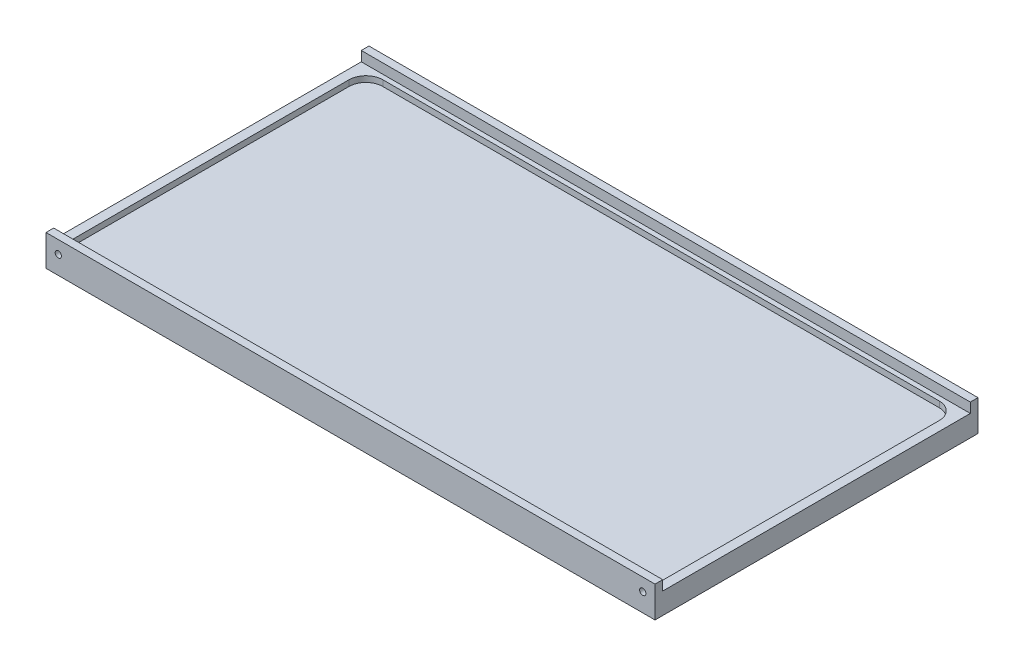
ISO-10303-21;
HEADER;
FILE_DESCRIPTION(('STEP AP214'),'2;1');
FILE_NAME('part.step','',(''),(''),'','','');
FILE_SCHEMA(('AUTOMOTIVE_DESIGN { 1 0 10303 214 1 1 1 1 }'));
ENDSEC;
DATA;
#1=APPLICATION_CONTEXT('core data for automotive mechanical design processes');
#2=APPLICATION_PROTOCOL_DEFINITION('international standard','automotive_design',2000,#1);
#3=PRODUCT_CONTEXT('',#1,'mechanical');
#4=PRODUCT('Part','Part','',(#3));
#5=PRODUCT_RELATED_PRODUCT_CATEGORY('part','',(#4));
#6=PRODUCT_DEFINITION_FORMATION('','',#4);
#7=PRODUCT_DEFINITION_CONTEXT('part definition',#1,'design');
#8=PRODUCT_DEFINITION('design','',#6,#7);
#9=PRODUCT_DEFINITION_SHAPE('','',#8);
#10=(LENGTH_UNIT() NAMED_UNIT(*) SI_UNIT(.MILLI.,.METRE.));
#11=(NAMED_UNIT(*) PLANE_ANGLE_UNIT() SI_UNIT($,.RADIAN.));
#12=(NAMED_UNIT(*) SI_UNIT($,.STERADIAN.) SOLID_ANGLE_UNIT());
#13=UNCERTAINTY_MEASURE_WITH_UNIT(LENGTH_MEASURE(1.E-05),#10,'distance_accuracy_value','');
#14=(GEOMETRIC_REPRESENTATION_CONTEXT(3) GLOBAL_UNCERTAINTY_ASSIGNED_CONTEXT((#13)) GLOBAL_UNIT_ASSIGNED_CONTEXT((#10,
#11,#12)) REPRESENTATION_CONTEXT('',''));
#15=CARTESIAN_POINT('',(0.,0.,0.));
#16=DIRECTION('',(0.,0.,1.));
#17=DIRECTION('',(1.,0.,0.));
#18=AXIS2_PLACEMENT_3D('',#15,#16,#17);
#19=CARTESIAN_POINT('',(-1000.,19.0499999999998,1009.525));
#20=DIRECTION('',(0.,-1.,0.));
#21=DIRECTION('',(1.,0.,0.));
#22=AXIS2_PLACEMENT_3D('',#19,#20,#21);
#23=PLANE('',#22);
#24=DIRECTION('',(0.,0.,-1.));
#25=VECTOR('',#24,1.);
#26=CARTESIAN_POINT('',(959.525,19.0499999999998,1009.525));
#27=LINE('',#26,#25);
#28=CARTESIAN_POINT('',(959.525,19.0499999999998,1009.525));
#29=VERTEX_POINT('',#28);
#30=CARTESIAN_POINT('',(959.525,19.0499999999998,95.4750000000002));
#31=VERTEX_POINT('',#30);
#32=EDGE_CURVE('E223',#29,#31,#27,.T.);
#33=ORIENTED_EDGE('',*,*,#32,.F.);
#34=DIRECTION('',(1.,0.,0.));
#35=VECTOR('',#34,1.);
#36=CARTESIAN_POINT('',(-1000.,19.0499999999996,1009.525));
#37=LINE('',#36,#35);
#38=CARTESIAN_POINT('',(-959.525,19.0499999999996,1009.525));
#39=VERTEX_POINT('',#38);
#40=EDGE_CURVE('E176',#39,#29,#37,.T.);
#41=ORIENTED_EDGE('',*,*,#40,.F.);
#42=DIRECTION('',(0.,0.,-1.));
#43=VECTOR('',#42,1.);
#44=CARTESIAN_POINT('',(-959.525,19.0499999999998,1009.525));
#45=LINE('',#44,#43);
#46=CARTESIAN_POINT('',(-959.525,19.0499999999998,95.4750000000002));
#47=VERTEX_POINT('',#46);
#48=EDGE_CURVE('E209',#39,#47,#45,.T.);
#49=ORIENTED_EDGE('',*,*,#48,.T.);
#50=CARTESIAN_POINT('',(-904.525,19.0499999999998,95.4750000000003));
#51=DIRECTION('',(0.,-1.,0.));
#52=DIRECTION('',(1.,0.,0.));
#53=AXIS2_PLACEMENT_3D('',#50,#51,#52);
#54=CIRCLE('',#53,55.);
#55=CARTESIAN_POINT('',(-904.525,19.0499999999998,40.4750000000003));
#56=VERTEX_POINT('',#55);
#57=EDGE_CURVE('E12',#47,#56,#54,.T.);
#58=ORIENTED_EDGE('',*,*,#57,.T.);
#59=DIRECTION('',(-1.,0.,0.));
#60=VECTOR('',#59,1.);
#61=CARTESIAN_POINT('',(-959.525,19.0499999999998,40.4750000000003));
#62=LINE('',#61,#60);
#63=CARTESIAN_POINT('',(904.525,19.0499999999996,40.4750000000003));
#64=VERTEX_POINT('',#63);
#65=EDGE_CURVE('E189',#64,#56,#62,.T.);
#66=ORIENTED_EDGE('',*,*,#65,.F.);
#67=CARTESIAN_POINT('',(904.525,19.0499999999996,95.4750000000002));
#68=DIRECTION('',(0.,-1.,0.));
#69=DIRECTION('',(1.,0.,0.));
#70=AXIS2_PLACEMENT_3D('',#67,#68,#69);
#71=CIRCLE('',#70,55.);
#72=EDGE_CURVE('E48',#64,#31,#71,.T.);
#73=ORIENTED_EDGE('',*,*,#72,.T.);
#74=EDGE_LOOP('',(#33,#41,#49,#58,#66,#73));
#75=FACE_BOUND('',#74,.T.);
#76=DIRECTION('',(0.,0.,-1.));
#77=VECTOR('',#76,1.);
#78=CARTESIAN_POINT('',(-990.,19.0499999999998,1009.525));
#79=LINE('',#78,#77);
#80=CARTESIAN_POINT('',(-990.,19.0499999999996,1025.));
#81=VERTEX_POINT('',#80);
#82=CARTESIAN_POINT('',(-990.,19.0499999999998,25.));
#83=VERTEX_POINT('',#82);
#84=EDGE_CURVE('E366',#81,#83,#79,.T.);
#85=ORIENTED_EDGE('',*,*,#84,.F.);
#86=DIRECTION('',(-1.,0.,0.));
#87=VECTOR('',#86,1.);
#88=CARTESIAN_POINT('',(-1000.,19.0499999999998,1025.));
#89=LINE('',#88,#87);
#90=CARTESIAN_POINT('',(-953.535530370396,19.0499999999998,1025.));
#91=VERTEX_POINT('',#90);
#92=EDGE_CURVE('E339',#91,#81,#89,.T.);
#93=ORIENTED_EDGE('',*,*,#92,.F.);
#94=CARTESIAN_POINT('',(-946.464469629604,19.0499999999998,1025.));
#95=VERTEX_POINT('',#94);
#96=EDGE_CURVE('E518',#95,#91,#89,.T.);
#97=ORIENTED_EDGE('',*,*,#96,.F.);
#98=CARTESIAN_POINT('',(946.464469629603,19.0499999999996,1025.));
#99=VERTEX_POINT('',#98);
#100=EDGE_CURVE('E519',#99,#95,#89,.T.);
#101=ORIENTED_EDGE('',*,*,#100,.F.);
#102=CARTESIAN_POINT('',(953.535530370398,19.0499999999996,1025.));
#103=VERTEX_POINT('',#102);
#104=EDGE_CURVE('E338',#103,#99,#89,.T.);
#105=ORIENTED_EDGE('',*,*,#104,.F.);
#106=CARTESIAN_POINT('',(990.,19.0499999999996,1025.));
#107=VERTEX_POINT('',#106);
#108=EDGE_CURVE('E334',#107,#103,#89,.T.);
#109=ORIENTED_EDGE('',*,*,#108,.F.);
#110=DIRECTION('',(0.,0.,1.));
#111=VECTOR('',#110,1.);
#112=CARTESIAN_POINT('',(990.,19.0499999999996,1009.525));
#113=LINE('',#112,#111);
#114=CARTESIAN_POINT('',(990.,19.0499999999996,25.));
#115=VERTEX_POINT('',#114);
#116=EDGE_CURVE('E375',#115,#107,#113,.T.);
#117=ORIENTED_EDGE('',*,*,#116,.F.);
#118=DIRECTION('',(1.,0.,0.));
#119=VECTOR('',#118,1.);
#120=CARTESIAN_POINT('',(-1000.,19.0499999999998,25.0000000000001));
#121=LINE('',#120,#119);
#122=EDGE_CURVE('E329',#83,#115,#121,.T.);
#123=ORIENTED_EDGE('',*,*,#122,.F.);
#124=EDGE_LOOP('',(#85,#93,#97,#101,#105,#109,#117,#123));
#125=FACE_BOUND('',#124,.T.);
#126=ADVANCED_FACE('F39',(#75,#125),#23,.F.);
#127=CARTESIAN_POINT('',(-1000.,-50.,1009.525));
#128=DIRECTION('',(0.,1.,0.));
#129=DIRECTION('',(0.,0.,1.));
#130=AXIS2_PLACEMENT_3D('',#127,#128,#129);
#131=PLANE('',#130);
#132=DIRECTION('',(0.,0.,-1.));
#133=VECTOR('',#132,1.);
#134=CARTESIAN_POINT('',(-990.,-50.,1050.));
#135=LINE('',#134,#133);
#136=CARTESIAN_POINT('',(-990.,-50.,1050.));
#137=VERTEX_POINT('',#136);
#138=CARTESIAN_POINT('',(-990.,-50.,0.));
#139=VERTEX_POINT('',#138);
#140=EDGE_CURVE('E150',#137,#139,#135,.T.);
#141=ORIENTED_EDGE('',*,*,#140,.T.);
#142=DIRECTION('',(1.,0.,0.));
#143=VECTOR('',#142,1.);
#144=CARTESIAN_POINT('',(-1000.,-50.,0.));
#145=LINE('',#144,#143);
#146=CARTESIAN_POINT('',(990.,-50.,0.));
#147=VERTEX_POINT('',#146);
#148=EDGE_CURVE('E193',#139,#147,#145,.T.);
#149=ORIENTED_EDGE('',*,*,#148,.T.);
#150=DIRECTION('',(0.,0.,-1.));
#151=VECTOR('',#150,1.);
#152=CARTESIAN_POINT('',(990.,-50.,1050.));
#153=LINE('',#152,#151);
#154=CARTESIAN_POINT('',(990.,-50.,1050.));
#155=VERTEX_POINT('',#154);
#156=EDGE_CURVE('E174',#155,#147,#153,.T.);
#157=ORIENTED_EDGE('',*,*,#156,.F.);
#158=DIRECTION('',(1.,0.,0.));
#159=VECTOR('',#158,1.);
#160=CARTESIAN_POINT('',(-1000.,-50.,1050.));
#161=LINE('',#160,#159);
#162=EDGE_CURVE('E166',#137,#155,#161,.T.);
#163=ORIENTED_EDGE('',*,*,#162,.F.);
#164=EDGE_LOOP('',(#141,#149,#157,#163));
#165=FACE_BOUND('',#164,.T.);
#166=ADVANCED_FACE('F173',(#165),#131,.F.);
#167=CARTESIAN_POINT('',(0.,0.,0.));
#168=DIRECTION('',(0.,0.,1.));
#169=DIRECTION('',(1.,0.,0.));
#170=AXIS2_PLACEMENT_3D('',#167,#168,#169);
#171=PLANE('',#170);
#172=DIRECTION('',(0.,1.,0.));
#173=VECTOR('',#172,1.);
#174=CARTESIAN_POINT('',(-990.,51.0499999999998,0.));
#175=LINE('',#174,#173);
#176=CARTESIAN_POINT('',(-990.,51.0499999999998,0.));
#177=VERTEX_POINT('',#176);
#178=EDGE_CURVE('E153',#139,#177,#175,.T.);
#179=ORIENTED_EDGE('',*,*,#178,.T.);
#180=DIRECTION('',(-1.,0.,0.));
#181=VECTOR('',#180,1.);
#182=CARTESIAN_POINT('',(-1000.,51.0499999999998,0.));
#183=LINE('',#182,#181);
#184=CARTESIAN_POINT('',(990.,51.0499999999998,0.));
#185=VERTEX_POINT('',#184);
#186=EDGE_CURVE('E185',#185,#177,#183,.T.);
#187=ORIENTED_EDGE('',*,*,#186,.F.);
#188=DIRECTION('',(0.,-1.,0.));
#189=VECTOR('',#188,1.);
#190=CARTESIAN_POINT('',(990.,51.0499999999998,0.));
#191=LINE('',#190,#189);
#192=EDGE_CURVE('E385',#185,#147,#191,.T.);
#193=ORIENTED_EDGE('',*,*,#192,.T.);
#194=ORIENTED_EDGE('',*,*,#148,.F.);
#195=EDGE_LOOP('',(#179,#187,#193,#194));
#196=FACE_BOUND('',#195,.T.);
#197=ADVANCED_FACE('F292',(#196),#171,.F.);
#198=CARTESIAN_POINT('',(-1000.,2019.45951448072,1050.));
#199=DIRECTION('',(0.,0.,-1.));
#200=DIRECTION('',(-1.,0.,0.));
#201=AXIS2_PLACEMENT_3D('',#198,#199,#200);
#202=PLANE('',#201);
#203=CARTESIAN_POINT('',(950.,9.52499999999982,1050.));
#204=DIRECTION('',(0.,0.,-1.));
#205=DIRECTION('',(-1.,0.,0.));
#206=AXIS2_PLACEMENT_3D('',#203,#204,#205);
#207=CIRCLE('',#206,10.1599999999999);
#208=CARTESIAN_POINT('',(939.84,9.52499999999982,1050.));
#209=VERTEX_POINT('',#208);
#210=EDGE_CURVE('E349',#209,#209,#207,.T.);
#211=ORIENTED_EDGE('',*,*,#210,.T.);
#212=EDGE_LOOP('',(#211));
#213=FACE_BOUND('',#212,.T.);
#214=CARTESIAN_POINT('',(-950.,9.52499999999958,1050.));
#215=DIRECTION('',(0.,0.,-1.));
#216=DIRECTION('',(-1.,0.,0.));
#217=AXIS2_PLACEMENT_3D('',#214,#215,#216);
#218=CIRCLE('',#217,10.1599999999999);
#219=CARTESIAN_POINT('',(-960.16,9.52499999999958,1050.));
#220=VERTEX_POINT('',#219);
#221=EDGE_CURVE('E351',#220,#220,#218,.T.);
#222=ORIENTED_EDGE('',*,*,#221,.T.);
#223=EDGE_LOOP('',(#222));
#224=FACE_BOUND('',#223,.T.);
#225=DIRECTION('',(0.,1.,0.));
#226=VECTOR('',#225,1.);
#227=CARTESIAN_POINT('',(-990.,51.0499999999998,1050.));
#228=LINE('',#227,#226);
#229=CARTESIAN_POINT('',(-990.,51.0499999999998,1050.));
#230=VERTEX_POINT('',#229);
#231=EDGE_CURVE('E55',#137,#230,#228,.T.);
#232=ORIENTED_EDGE('',*,*,#231,.F.);
#233=ORIENTED_EDGE('',*,*,#162,.T.);
#234=DIRECTION('',(0.,-1.,0.));
#235=VECTOR('',#234,1.);
#236=CARTESIAN_POINT('',(990.,51.0499999999998,1050.));
#237=LINE('',#236,#235);
#238=CARTESIAN_POINT('',(990.,51.0499999999998,1050.));
#239=VERTEX_POINT('',#238);
#240=EDGE_CURVE('E384',#239,#155,#237,.T.);
#241=ORIENTED_EDGE('',*,*,#240,.F.);
#242=DIRECTION('',(1.,0.,0.));
#243=VECTOR('',#242,1.);
#244=CARTESIAN_POINT('',(-1000.,51.0499999999998,1050.));
#245=LINE('',#244,#243);
#246=EDGE_CURVE('E168',#230,#239,#245,.T.);
#247=ORIENTED_EDGE('',*,*,#246,.F.);
#248=EDGE_LOOP('',(#232,#233,#241,#247));
#249=FACE_BOUND('',#248,.T.);
#250=ADVANCED_FACE('F164',(#213,#224,#249),#202,.F.);
#251=CARTESIAN_POINT('',(-1000.,51.0499999999998,25.0000000000001));
#252=DIRECTION('',(0.,0.,-1.));
#253=DIRECTION('',(-1.,0.,0.));
#254=AXIS2_PLACEMENT_3D('',#251,#252,#253);
#255=PLANE('',#254);
#256=DIRECTION('',(0.,1.,0.));
#257=VECTOR('',#256,1.);
#258=CARTESIAN_POINT('',(-990.,51.0499999999998,25.0000000000001));
#259=LINE('',#258,#257);
#260=CARTESIAN_POINT('',(-990.,51.0499999999998,25.0000000000001));
#261=VERTEX_POINT('',#260);
#262=EDGE_CURVE('E355',#83,#261,#259,.T.);
#263=ORIENTED_EDGE('',*,*,#262,.F.);
#264=ORIENTED_EDGE('',*,*,#122,.T.);
#265=DIRECTION('',(0.,-1.,0.));
#266=VECTOR('',#265,1.);
#267=CARTESIAN_POINT('',(990.,51.0499999999998,24.9999999999999));
#268=LINE('',#267,#266);
#269=CARTESIAN_POINT('',(990.,51.0499999999998,25.0000000000001));
#270=VERTEX_POINT('',#269);
#271=EDGE_CURVE('E372',#270,#115,#268,.T.);
#272=ORIENTED_EDGE('',*,*,#271,.F.);
#273=DIRECTION('',(1.,0.,0.));
#274=VECTOR('',#273,1.);
#275=CARTESIAN_POINT('',(-1000.,51.0499999999998,25.0000000000001));
#276=LINE('',#275,#274);
#277=EDGE_CURVE('E177',#261,#270,#276,.T.);
#278=ORIENTED_EDGE('',*,*,#277,.F.);
#279=EDGE_LOOP('',(#263,#264,#272,#278));
#280=FACE_BOUND('',#279,.T.);
#281=ADVANCED_FACE('F314',(#280),#255,.F.);
#282=CARTESIAN_POINT('',(0.,51.0499999999997,0.));
#283=DIRECTION('',(0.,1.,0.));
#284=DIRECTION('',(-1.,0.,0.));
#285=AXIS2_PLACEMENT_3D('',#282,#283,#284);
#286=PLANE('',#285);
#287=ORIENTED_EDGE('',*,*,#186,.T.);
#288=DIRECTION('',(0.,0.,-1.));
#289=VECTOR('',#288,1.);
#290=CARTESIAN_POINT('',(-990.,51.0499999999998,1050.));
#291=LINE('',#290,#289);
#292=EDGE_CURVE('E170',#261,#177,#291,.T.);
#293=ORIENTED_EDGE('',*,*,#292,.F.);
#294=ORIENTED_EDGE('',*,*,#277,.T.);
#295=DIRECTION('',(0.,0.,-1.));
#296=VECTOR('',#295,1.);
#297=CARTESIAN_POINT('',(990.,51.0499999999998,1050.));
#298=LINE('',#297,#296);
#299=EDGE_CURVE('E327',#270,#185,#298,.T.);
#300=ORIENTED_EDGE('',*,*,#299,.T.);
#301=EDGE_LOOP('',(#287,#293,#294,#300));
#302=FACE_BOUND('',#301,.T.);
#303=ADVANCED_FACE('F325',(#302),#286,.T.);
#304=CARTESIAN_POINT('',(-1000.,51.0499999999998,1025.));
#305=DIRECTION('',(0.,0.,1.));
#306=DIRECTION('',(1.,0.,0.));
#307=AXIS2_PLACEMENT_3D('',#304,#305,#306);
#308=PLANE('',#307);
#309=DIRECTION('',(0.,-1.,0.));
#310=VECTOR('',#309,1.);
#311=CARTESIAN_POINT('',(-990.,51.0499999999998,1025.));
#312=LINE('',#311,#310);
#313=CARTESIAN_POINT('',(-990.,51.0499999999998,1025.));
#314=VERTEX_POINT('',#313);
#315=EDGE_CURVE('E369',#314,#81,#312,.T.);
#316=ORIENTED_EDGE('',*,*,#315,.F.);
#317=DIRECTION('',(-1.,0.,0.));
#318=VECTOR('',#317,1.);
#319=CARTESIAN_POINT('',(-1000.,51.0499999999998,1025.));
#320=LINE('',#319,#318);
#321=CARTESIAN_POINT('',(990.,51.0499999999996,1025.));
#322=VERTEX_POINT('',#321);
#323=EDGE_CURVE('E337',#322,#314,#320,.T.);
#324=ORIENTED_EDGE('',*,*,#323,.F.);
#325=DIRECTION('',(0.,1.,0.));
#326=VECTOR('',#325,1.);
#327=CARTESIAN_POINT('',(990.,51.0499999999998,1025.));
#328=LINE('',#327,#326);
#329=EDGE_CURVE('E63',#107,#322,#328,.T.);
#330=ORIENTED_EDGE('',*,*,#329,.F.);
#331=ORIENTED_EDGE('',*,*,#108,.T.);
#332=CARTESIAN_POINT('',(950.,9.52499999999982,1025.));
#333=DIRECTION('',(0.,0.,1.));
#334=DIRECTION('',(1.,0.,0.));
#335=AXIS2_PLACEMENT_3D('',#332,#333,#334);
#336=CIRCLE('',#335,10.1599999999999);
#337=EDGE_CURVE('E356',#103,#99,#336,.T.);
#338=ORIENTED_EDGE('',*,*,#337,.T.);
#339=ORIENTED_EDGE('',*,*,#100,.T.);
#340=CARTESIAN_POINT('',(-950.,9.52499999999958,1025.));
#341=DIRECTION('',(0.,0.,1.));
#342=DIRECTION('',(1.,0.,0.));
#343=AXIS2_PLACEMENT_3D('',#340,#341,#342);
#344=CIRCLE('',#343,10.1599999999999);
#345=EDGE_CURVE('E345',#95,#91,#344,.T.);
#346=ORIENTED_EDGE('',*,*,#345,.T.);
#347=ORIENTED_EDGE('',*,*,#92,.T.);
#348=EDGE_LOOP('',(#316,#324,#330,#331,#338,#339,#346,#347));
#349=FACE_BOUND('',#348,.T.);
#350=ADVANCED_FACE('F406',(#349),#308,.F.);
#351=CARTESIAN_POINT('',(0.,51.0499999999997,0.));
#352=DIRECTION('',(0.,1.,0.));
#353=DIRECTION('',(-1.,0.,0.));
#354=AXIS2_PLACEMENT_3D('',#351,#352,#353);
#355=PLANE('',#354);
#356=ORIENTED_EDGE('',*,*,#323,.T.);
#357=EDGE_CURVE('E159',#230,#314,#291,.T.);
#358=ORIENTED_EDGE('',*,*,#357,.F.);
#359=ORIENTED_EDGE('',*,*,#246,.T.);
#360=EDGE_CURVE('E320',#239,#322,#298,.T.);
#361=ORIENTED_EDGE('',*,*,#360,.T.);
#362=EDGE_LOOP('',(#356,#358,#359,#361));
#363=FACE_BOUND('',#362,.T.);
#364=ADVANCED_FACE('F301',(#363),#355,.T.);
#365=CARTESIAN_POINT('',(959.525,19.0499999999998,1009.525));
#366=DIRECTION('',(1.,0.,0.));
#367=DIRECTION('',(0.,0.,-1.));
#368=AXIS2_PLACEMENT_3D('',#365,#366,#367);
#369=PLANE('',#368);
#370=ORIENTED_EDGE('',*,*,#32,.T.);
#371=DIRECTION('',(0.,-1.,0.));
#372=VECTOR('',#371,1.);
#373=CARTESIAN_POINT('',(959.525,0.,95.4750000000002));
#374=LINE('',#373,#372);
#375=CARTESIAN_POINT('',(959.525,0.,95.4750000000002));
#376=VERTEX_POINT('',#375);
#377=EDGE_CURVE('E227',#31,#376,#374,.T.);
#378=ORIENTED_EDGE('',*,*,#377,.T.);
#379=DIRECTION('',(0.,0.,-1.));
#380=VECTOR('',#379,1.);
#381=CARTESIAN_POINT('',(959.525,0.,1009.525));
#382=LINE('',#381,#380);
#383=CARTESIAN_POINT('',(959.525,0.,1009.525));
#384=VERTEX_POINT('',#383);
#385=EDGE_CURVE('E219',#384,#376,#382,.T.);
#386=ORIENTED_EDGE('',*,*,#385,.F.);
#387=DIRECTION('',(0.,-1.,0.));
#388=VECTOR('',#387,1.);
#389=CARTESIAN_POINT('',(959.525,19.0499999999998,1009.525));
#390=LINE('',#389,#388);
#391=EDGE_CURVE('E197',#29,#384,#390,.T.);
#392=ORIENTED_EDGE('',*,*,#391,.F.);
#393=EDGE_LOOP('',(#370,#378,#386,#392));
#394=FACE_BOUND('',#393,.T.);
#395=ADVANCED_FACE('F257',(#394),#369,.F.);
#396=CARTESIAN_POINT('',(-959.525,0.,1009.525));
#397=DIRECTION('',(0.,-1.,0.));
#398=DIRECTION('',(0.,0.,-1.));
#399=AXIS2_PLACEMENT_3D('',#396,#397,#398);
#400=PLANE('',#399);
#401=ORIENTED_EDGE('',*,*,#385,.T.);
#402=CARTESIAN_POINT('',(904.525,0.,95.4750000000002));
#403=DIRECTION('',(0.,-1.,0.));
#404=DIRECTION('',(0.,0.,-1.));
#405=AXIS2_PLACEMENT_3D('',#402,#403,#404);
#406=CIRCLE('',#405,55.);
#407=CARTESIAN_POINT('',(904.525,0.,40.4750000000003));
#408=VERTEX_POINT('',#407);
#409=EDGE_CURVE('E234',#376,#408,#406,.F.);
#410=ORIENTED_EDGE('',*,*,#409,.T.);
#411=DIRECTION('',(1.,0.,0.));
#412=VECTOR('',#411,1.);
#413=CARTESIAN_POINT('',(-959.525,0.,40.4750000000003));
#414=LINE('',#413,#412);
#415=CARTESIAN_POINT('',(-904.525,0.,40.4750000000003));
#416=VERTEX_POINT('',#415);
#417=EDGE_CURVE('E182',#416,#408,#414,.T.);
#418=ORIENTED_EDGE('',*,*,#417,.F.);
#419=CARTESIAN_POINT('',(-904.525,0.,95.4750000000003));
#420=DIRECTION('',(0.,-1.,0.));
#421=DIRECTION('',(0.,0.,-1.));
#422=AXIS2_PLACEMENT_3D('',#419,#420,#421);
#423=CIRCLE('',#422,55.);
#424=CARTESIAN_POINT('',(-959.525,0.,95.4750000000002));
#425=VERTEX_POINT('',#424);
#426=EDGE_CURVE('E231',#416,#425,#423,.F.);
#427=ORIENTED_EDGE('',*,*,#426,.T.);
#428=DIRECTION('',(0.,0.,-1.));
#429=VECTOR('',#428,1.);
#430=CARTESIAN_POINT('',(-959.525,0.,1009.525));
#431=LINE('',#430,#429);
#432=CARTESIAN_POINT('',(-959.525,0.,1009.525));
#433=VERTEX_POINT('',#432);
#434=EDGE_CURVE('E215',#433,#425,#431,.T.);
#435=ORIENTED_EDGE('',*,*,#434,.F.);
#436=DIRECTION('',(-1.,0.,0.));
#437=VECTOR('',#436,1.);
#438=CARTESIAN_POINT('',(-959.525,0.,1009.525));
#439=LINE('',#438,#437);
#440=EDGE_CURVE('E201',#384,#433,#439,.T.);
#441=ORIENTED_EDGE('',*,*,#440,.F.);
#442=EDGE_LOOP('',(#401,#410,#418,#427,#435,#441));
#443=FACE_BOUND('',#442,.T.);
#444=ADVANCED_FACE('F261',(#443),#400,.F.);
#445=CARTESIAN_POINT('',(-959.525,19.0499999999998,1009.525));
#446=DIRECTION('',(-1.,0.,0.));
#447=DIRECTION('',(0.,0.,1.));
#448=AXIS2_PLACEMENT_3D('',#445,#446,#447);
#449=PLANE('',#448);
#450=ORIENTED_EDGE('',*,*,#434,.T.);
#451=DIRECTION('',(0.,-1.,0.));
#452=VECTOR('',#451,1.);
#453=CARTESIAN_POINT('',(-959.525,19.0499999999998,95.4750000000003));
#454=LINE('',#453,#452);
#455=EDGE_CURVE('E244',#425,#47,#454,.F.);
#456=ORIENTED_EDGE('',*,*,#455,.T.);
#457=ORIENTED_EDGE('',*,*,#48,.F.);
#458=DIRECTION('',(0.,1.,0.));
#459=VECTOR('',#458,1.);
#460=CARTESIAN_POINT('',(-959.525,19.0499999999998,1009.525));
#461=LINE('',#460,#459);
#462=EDGE_CURVE('E205',#433,#39,#461,.T.);
#463=ORIENTED_EDGE('',*,*,#462,.F.);
#464=EDGE_LOOP('',(#450,#456,#457,#463));
#465=FACE_BOUND('',#464,.T.);
#466=ADVANCED_FACE('F271',(#465),#449,.F.);
#467=CARTESIAN_POINT('',(-959.525,1938.52678499246,40.4750000000003));
#468=DIRECTION('',(0.,0.,-1.));
#469=DIRECTION('',(-1.,0.,0.));
#470=AXIS2_PLACEMENT_3D('',#467,#468,#469);
#471=PLANE('',#470);
#472=ORIENTED_EDGE('',*,*,#417,.T.);
#473=DIRECTION('',(0.,-1.,0.));
#474=VECTOR('',#473,1.);
#475=CARTESIAN_POINT('',(904.525,19.0499999999998,40.4750000000003));
#476=LINE('',#475,#474);
#477=EDGE_CURVE('E241',#408,#64,#476,.F.);
#478=ORIENTED_EDGE('',*,*,#477,.T.);
#479=ORIENTED_EDGE('',*,*,#65,.T.);
#480=DIRECTION('',(0.,-1.,0.));
#481=VECTOR('',#480,1.);
#482=CARTESIAN_POINT('',(-904.525,0.,40.4750000000003));
#483=LINE('',#482,#481);
#484=EDGE_CURVE('E237',#56,#416,#483,.T.);
#485=ORIENTED_EDGE('',*,*,#484,.T.);
#486=EDGE_LOOP('',(#472,#478,#479,#485));
#487=FACE_BOUND('',#486,.T.);
#488=ADVANCED_FACE('F264',(#487),#471,.F.);
#489=CARTESIAN_POINT('',(904.525,19.0499999999998,95.4750000000002));
#490=DIRECTION('',(0.,1.,0.));
#491=DIRECTION('',(0.,0.,1.));
#492=AXIS2_PLACEMENT_3D('',#489,#490,#491);
#493=CYLINDRICAL_SURFACE('',#492,55.);
#494=ORIENTED_EDGE('',*,*,#72,.F.);
#495=ORIENTED_EDGE('',*,*,#477,.F.);
#496=ORIENTED_EDGE('',*,*,#409,.F.);
#497=ORIENTED_EDGE('',*,*,#377,.F.);
#498=EDGE_LOOP('',(#494,#495,#496,#497));
#499=FACE_BOUND('',#498,.T.);
#500=ADVANCED_FACE('F258',(#499),#493,.F.);
#501=CARTESIAN_POINT('',(-904.525,1938.52678499246,95.4750000000003));
#502=DIRECTION('',(0.,1.,0.));
#503=DIRECTION('',(0.,0.,1.));
#504=AXIS2_PLACEMENT_3D('',#501,#502,#503);
#505=CYLINDRICAL_SURFACE('',#504,55.);
#506=ORIENTED_EDGE('',*,*,#57,.F.);
#507=ORIENTED_EDGE('',*,*,#455,.F.);
#508=ORIENTED_EDGE('',*,*,#426,.F.);
#509=ORIENTED_EDGE('',*,*,#484,.F.);
#510=EDGE_LOOP('',(#506,#507,#508,#509));
#511=FACE_BOUND('',#510,.T.);
#512=ADVANCED_FACE('F41',(#511),#505,.F.);
#513=CARTESIAN_POINT('',(-1000.,2019.45951448072,1009.525));
#514=DIRECTION('',(0.,0.,1.));
#515=DIRECTION('',(1.,0.,0.));
#516=AXIS2_PLACEMENT_3D('',#513,#514,#515);
#517=PLANE('',#516);
#518=ORIENTED_EDGE('',*,*,#40,.T.);
#519=ORIENTED_EDGE('',*,*,#391,.T.);
#520=ORIENTED_EDGE('',*,*,#440,.T.);
#521=ORIENTED_EDGE('',*,*,#462,.T.);
#522=EDGE_LOOP('',(#518,#519,#520,#521));
#523=FACE_BOUND('',#522,.T.);
#524=ADVANCED_FACE('F273',(#523),#517,.F.);
#525=CARTESIAN_POINT('',(-1000.,51.0499999999998,1025.));
#526=DIRECTION('',(0.,0.,1.));
#527=DIRECTION('',(1.,0.,0.));
#528=AXIS2_PLACEMENT_3D('',#525,#526,#527);
#529=PLANE('',#528);
#530=ORIENTED_EDGE('',*,*,#96,.T.);
#531=EDGE_CURVE('E350',#91,#95,#344,.T.);
#532=ORIENTED_EDGE('',*,*,#531,.T.);
#533=EDGE_LOOP('',(#530,#532));
#534=FACE_BOUND('',#533,.T.);
#535=ADVANCED_FACE('F275',(#534),#529,.T.);
#536=CARTESIAN_POINT('',(-950.,9.52499999999958,996.263180412579));
#537=DIRECTION('',(0.,0.,1.));
#538=DIRECTION('',(1.,0.,0.));
#539=AXIS2_PLACEMENT_3D('',#536,#537,#538);
#540=CYLINDRICAL_SURFACE('',#539,10.1599999999999);
#541=ORIENTED_EDGE('',*,*,#345,.F.);
#542=ORIENTED_EDGE('',*,*,#531,.F.);
#543=EDGE_LOOP('',(#541,#542));
#544=FACE_BOUND('',#543,.T.);
#545=ORIENTED_EDGE('',*,*,#221,.F.);
#546=EDGE_LOOP('',(#545));
#547=FACE_BOUND('',#546,.T.);
#548=ADVANCED_FACE('F281',(#544,#547),#540,.F.);
#549=CARTESIAN_POINT('',(-1000.,51.0499999999998,1025.));
#550=DIRECTION('',(0.,0.,1.));
#551=DIRECTION('',(1.,0.,0.));
#552=AXIS2_PLACEMENT_3D('',#549,#550,#551);
#553=PLANE('',#552);
#554=ORIENTED_EDGE('',*,*,#104,.T.);
#555=EDGE_CURVE('E360',#99,#103,#336,.T.);
#556=ORIENTED_EDGE('',*,*,#555,.T.);
#557=EDGE_LOOP('',(#554,#556));
#558=FACE_BOUND('',#557,.T.);
#559=ADVANCED_FACE('F446',(#558),#553,.T.);
#560=CARTESIAN_POINT('',(950.,9.52499999999982,996.263180412579));
#561=DIRECTION('',(0.,0.,1.));
#562=DIRECTION('',(1.,0.,0.));
#563=AXIS2_PLACEMENT_3D('',#560,#561,#562);
#564=CYLINDRICAL_SURFACE('',#563,10.1599999999999);
#565=ORIENTED_EDGE('',*,*,#337,.F.);
#566=ORIENTED_EDGE('',*,*,#555,.F.);
#567=EDGE_LOOP('',(#565,#566));
#568=FACE_BOUND('',#567,.T.);
#569=ORIENTED_EDGE('',*,*,#210,.F.);
#570=EDGE_LOOP('',(#569));
#571=FACE_BOUND('',#570,.T.);
#572=ADVANCED_FACE('F443',(#568,#571),#564,.F.);
#573=CARTESIAN_POINT('',(990.,51.0499999999998,1050.));
#574=DIRECTION('',(1.,0.,0.));
#575=DIRECTION('',(0.,0.,-1.));
#576=AXIS2_PLACEMENT_3D('',#573,#574,#575);
#577=PLANE('',#576);
#578=ORIENTED_EDGE('',*,*,#271,.T.);
#579=ORIENTED_EDGE('',*,*,#116,.T.);
#580=ORIENTED_EDGE('',*,*,#329,.T.);
#581=ORIENTED_EDGE('',*,*,#360,.F.);
#582=ORIENTED_EDGE('',*,*,#240,.T.);
#583=ORIENTED_EDGE('',*,*,#156,.T.);
#584=ORIENTED_EDGE('',*,*,#192,.F.);
#585=ORIENTED_EDGE('',*,*,#299,.F.);
#586=EDGE_LOOP('',(#578,#579,#580,#581,#582,#583,#584,#585));
#587=FACE_BOUND('',#586,.T.);
#588=ADVANCED_FACE('F403',(#587),#577,.T.);
#589=CARTESIAN_POINT('',(-990.,51.0499999999998,1050.));
#590=DIRECTION('',(-1.,0.,0.));
#591=DIRECTION('',(0.,0.,1.));
#592=AXIS2_PLACEMENT_3D('',#589,#590,#591);
#593=PLANE('',#592);
#594=ORIENTED_EDGE('',*,*,#262,.T.);
#595=ORIENTED_EDGE('',*,*,#292,.T.);
#596=ORIENTED_EDGE('',*,*,#178,.F.);
#597=ORIENTED_EDGE('',*,*,#140,.F.);
#598=ORIENTED_EDGE('',*,*,#231,.T.);
#599=ORIENTED_EDGE('',*,*,#357,.T.);
#600=ORIENTED_EDGE('',*,*,#315,.T.);
#601=ORIENTED_EDGE('',*,*,#84,.T.);
#602=EDGE_LOOP('',(#594,#595,#596,#597,#598,#599,#600,#601));
#603=FACE_BOUND('',#602,.T.);
#604=ADVANCED_FACE('F151',(#603),#593,.T.);
#605=CLOSED_SHELL('',(#126,#166,#197,#250,#281,#303,#350,#364,#395,#444,#466,#488,#500,#512,
#524,#535,#548,#559,#572,#588,#604));
#606=MANIFOLD_SOLID_BREP('B2',#605);
#607=ADVANCED_BREP_SHAPE_REPRESENTATION('',(#18,#606),#14);
#608=SHAPE_DEFINITION_REPRESENTATION(#9,#607);
ENDSEC;
END-ISO-10303-21;
